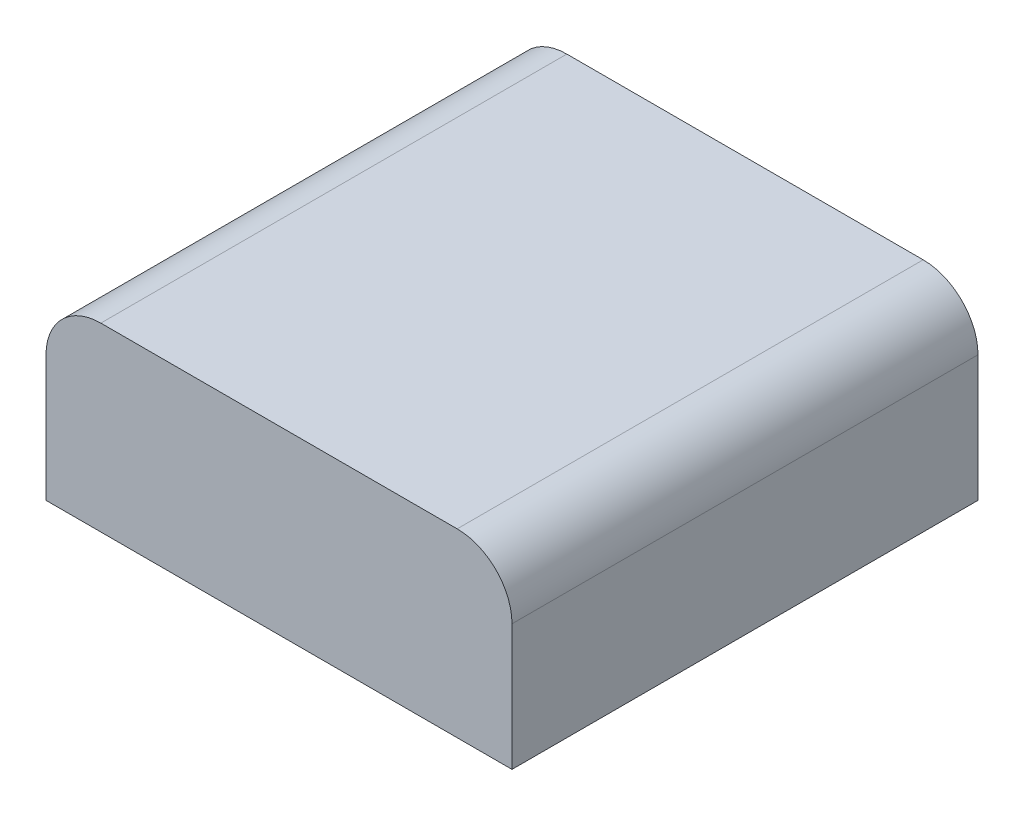
ISO-10303-21;
HEADER;
FILE_DESCRIPTION(('STEP AP214'),'2;1');
FILE_NAME('part.step','',(''),(''),'','','');
FILE_SCHEMA(('AUTOMOTIVE_DESIGN { 1 0 10303 214 1 1 1 1 }'));
ENDSEC;
DATA;
#1=APPLICATION_CONTEXT('core data for automotive mechanical design processes');
#2=APPLICATION_PROTOCOL_DEFINITION('international standard','automotive_design',2000,#1);
#3=PRODUCT_CONTEXT('',#1,'mechanical');
#4=PRODUCT('Part','Part','',(#3));
#5=PRODUCT_RELATED_PRODUCT_CATEGORY('part','',(#4));
#6=PRODUCT_DEFINITION_FORMATION('','',#4);
#7=PRODUCT_DEFINITION_CONTEXT('part definition',#1,'design');
#8=PRODUCT_DEFINITION('design','',#6,#7);
#9=PRODUCT_DEFINITION_SHAPE('','',#8);
#10=(LENGTH_UNIT() NAMED_UNIT(*) SI_UNIT(.MILLI.,.METRE.));
#11=(NAMED_UNIT(*) PLANE_ANGLE_UNIT() SI_UNIT($,.RADIAN.));
#12=(NAMED_UNIT(*) SI_UNIT($,.STERADIAN.) SOLID_ANGLE_UNIT());
#13=UNCERTAINTY_MEASURE_WITH_UNIT(LENGTH_MEASURE(1.E-05),#10,'distance_accuracy_value','');
#14=(GEOMETRIC_REPRESENTATION_CONTEXT(3) GLOBAL_UNCERTAINTY_ASSIGNED_CONTEXT((#13)) GLOBAL_UNIT_ASSIGNED_CONTEXT((#10,
#11,#12)) REPRESENTATION_CONTEXT('',''));
#15=CARTESIAN_POINT('',(0.,0.,0.));
#16=DIRECTION('',(0.,0.,1.));
#17=DIRECTION('',(1.,0.,0.));
#18=AXIS2_PLACEMENT_3D('',#15,#16,#17);
#19=CARTESIAN_POINT('',(-42.5,-16.5,42.5));
#20=DIRECTION('',(0.,1.,0.));
#21=DIRECTION('',(0.,0.,1.));
#22=AXIS2_PLACEMENT_3D('',#19,#20,#21);
#23=PLANE('',#22);
#24=DIRECTION('',(1.,0.,0.));
#25=VECTOR('',#24,1.);
#26=CARTESIAN_POINT('',(-42.5,-16.5,-42.5));
#27=LINE('',#26,#25);
#28=CARTESIAN_POINT('',(-42.5,-16.5,-42.5));
#29=VERTEX_POINT('',#28);
#30=CARTESIAN_POINT('',(42.5,-16.5,-42.5));
#31=VERTEX_POINT('',#30);
#32=EDGE_CURVE('E84',#29,#31,#27,.T.);
#33=ORIENTED_EDGE('',*,*,#32,.T.);
#34=DIRECTION('',(0.,0.,-1.));
#35=VECTOR('',#34,1.);
#36=CARTESIAN_POINT('',(42.5,-16.5,42.5));
#37=LINE('',#36,#35);
#38=CARTESIAN_POINT('',(42.5,-16.5,42.5));
#39=VERTEX_POINT('',#38);
#40=EDGE_CURVE('E126',#39,#31,#37,.T.);
#41=ORIENTED_EDGE('',*,*,#40,.F.);
#42=DIRECTION('',(1.,0.,0.));
#43=VECTOR('',#42,1.);
#44=CARTESIAN_POINT('',(-42.5,-16.5,42.5));
#45=LINE('',#44,#43);
#46=CARTESIAN_POINT('',(-42.5,-16.5,42.5));
#47=VERTEX_POINT('',#46);
#48=EDGE_CURVE('E57',#47,#39,#45,.T.);
#49=ORIENTED_EDGE('',*,*,#48,.F.);
#50=DIRECTION('',(0.,0.,-1.));
#51=VECTOR('',#50,1.);
#52=CARTESIAN_POINT('',(-42.5,-16.5,42.5));
#53=LINE('',#52,#51);
#54=EDGE_CURVE('E122',#47,#29,#53,.T.);
#55=ORIENTED_EDGE('',*,*,#54,.T.);
#56=EDGE_LOOP('',(#33,#41,#49,#55));
#57=FACE_BOUND('',#56,.T.);
#58=DIRECTION('',(1.,0.,0.));
#59=VECTOR('',#58,1.);
#60=CARTESIAN_POINT('',(-32.5,-16.5,-40.5));
#61=LINE('',#60,#59);
#62=CARTESIAN_POINT('',(-40.5,-16.5,-40.5));
#63=VERTEX_POINT('',#62);
#64=CARTESIAN_POINT('',(40.5,-16.5,-40.5));
#65=VERTEX_POINT('',#64);
#66=EDGE_CURVE('E159',#63,#65,#61,.T.);
#67=ORIENTED_EDGE('',*,*,#66,.F.);
#68=DIRECTION('',(0.,0.,-1.));
#69=VECTOR('',#68,1.);
#70=CARTESIAN_POINT('',(-40.5,-16.5,42.5));
#71=LINE('',#70,#69);
#72=CARTESIAN_POINT('',(-40.5,-16.5,40.5));
#73=VERTEX_POINT('',#72);
#74=EDGE_CURVE('E164',#73,#63,#71,.T.);
#75=ORIENTED_EDGE('',*,*,#74,.F.);
#76=DIRECTION('',(1.,0.,0.));
#77=VECTOR('',#76,1.);
#78=CARTESIAN_POINT('',(-32.5,-16.5,40.5));
#79=LINE('',#78,#77);
#80=CARTESIAN_POINT('',(40.5,-16.5,40.5));
#81=VERTEX_POINT('',#80);
#82=EDGE_CURVE('E48',#73,#81,#79,.T.);
#83=ORIENTED_EDGE('',*,*,#82,.T.);
#84=DIRECTION('',(0.,0.,-1.));
#85=VECTOR('',#84,1.);
#86=CARTESIAN_POINT('',(40.5,-16.5,42.5));
#87=LINE('',#86,#85);
#88=EDGE_CURVE('E168',#81,#65,#87,.T.);
#89=ORIENTED_EDGE('',*,*,#88,.T.);
#90=EDGE_LOOP('',(#67,#75,#83,#89));
#91=FACE_BOUND('',#90,.T.);
#92=ADVANCED_FACE('F33',(#57,#91),#23,.F.);
#93=CARTESIAN_POINT('',(42.5,6.5,42.5));
#94=DIRECTION('',(-1.,0.,0.));
#95=DIRECTION('',(0.,0.,1.));
#96=AXIS2_PLACEMENT_3D('',#93,#94,#95);
#97=PLANE('',#96);
#98=DIRECTION('',(0.,1.,0.));
#99=VECTOR('',#98,1.);
#100=CARTESIAN_POINT('',(42.5,6.5,-42.5));
#101=LINE('',#100,#99);
#102=CARTESIAN_POINT('',(42.5,6.5,-42.5));
#103=VERTEX_POINT('',#102);
#104=EDGE_CURVE('E130',#31,#103,#101,.T.);
#105=ORIENTED_EDGE('',*,*,#104,.T.);
#106=DIRECTION('',(0.,0.,-1.));
#107=VECTOR('',#106,1.);
#108=CARTESIAN_POINT('',(42.5,6.5,42.5));
#109=LINE('',#108,#107);
#110=CARTESIAN_POINT('',(42.5,6.5,42.5));
#111=VERTEX_POINT('',#110);
#112=EDGE_CURVE('E11',#111,#103,#109,.T.);
#113=ORIENTED_EDGE('',*,*,#112,.F.);
#114=DIRECTION('',(0.,1.,0.));
#115=VECTOR('',#114,1.);
#116=CARTESIAN_POINT('',(42.5,6.5,42.5));
#117=LINE('',#116,#115);
#118=EDGE_CURVE('E142',#39,#111,#117,.T.);
#119=ORIENTED_EDGE('',*,*,#118,.F.);
#120=ORIENTED_EDGE('',*,*,#40,.T.);
#121=EDGE_LOOP('',(#105,#113,#119,#120));
#122=FACE_BOUND('',#121,.T.);
#123=ADVANCED_FACE('F35',(#122),#97,.F.);
#124=CARTESIAN_POINT('',(32.5,6.5,42.5));
#125=DIRECTION('',(0.,0.,-1.));
#126=DIRECTION('',(-1.,0.,0.));
#127=AXIS2_PLACEMENT_3D('',#124,#125,#126);
#128=CYLINDRICAL_SURFACE('',#127,10.);
#129=CARTESIAN_POINT('',(32.5,6.5,-42.5));
#130=DIRECTION('',(0.,0.,1.));
#131=DIRECTION('',(1.,0.,0.));
#132=AXIS2_PLACEMENT_3D('',#129,#130,#131);
#133=CIRCLE('',#132,10.);
#134=CARTESIAN_POINT('',(32.5,16.5,-42.5));
#135=VERTEX_POINT('',#134);
#136=EDGE_CURVE('E133',#103,#135,#133,.T.);
#137=ORIENTED_EDGE('',*,*,#136,.T.);
#138=DIRECTION('',(0.,0.,-1.));
#139=VECTOR('',#138,1.);
#140=CARTESIAN_POINT('',(32.5,16.5,42.5));
#141=LINE('',#140,#139);
#142=CARTESIAN_POINT('',(32.5,16.5,42.5));
#143=VERTEX_POINT('',#142);
#144=EDGE_CURVE('E41',#143,#135,#141,.T.);
#145=ORIENTED_EDGE('',*,*,#144,.F.);
#146=CARTESIAN_POINT('',(32.5,6.5,42.5));
#147=DIRECTION('',(0.,0.,1.));
#148=DIRECTION('',(1.,0.,0.));
#149=AXIS2_PLACEMENT_3D('',#146,#147,#148);
#150=CIRCLE('',#149,10.);
#151=EDGE_CURVE('E92',#111,#143,#150,.T.);
#152=ORIENTED_EDGE('',*,*,#151,.F.);
#153=ORIENTED_EDGE('',*,*,#112,.T.);
#154=EDGE_LOOP('',(#137,#145,#152,#153));
#155=FACE_BOUND('',#154,.T.);
#156=ADVANCED_FACE('F267',(#155),#128,.T.);
#157=CARTESIAN_POINT('',(-32.5,16.5,42.5));
#158=DIRECTION('',(0.,-1.,0.));
#159=DIRECTION('',(1.,0.,0.));
#160=AXIS2_PLACEMENT_3D('',#157,#158,#159);
#161=PLANE('',#160);
#162=DIRECTION('',(-1.,0.,0.));
#163=VECTOR('',#162,1.);
#164=CARTESIAN_POINT('',(-32.5,16.5,-42.5));
#165=LINE('',#164,#163);
#166=CARTESIAN_POINT('',(-32.5,16.5,-42.5));
#167=VERTEX_POINT('',#166);
#168=EDGE_CURVE('E136',#135,#167,#165,.T.);
#169=ORIENTED_EDGE('',*,*,#168,.T.);
#170=DIRECTION('',(0.,0.,-1.));
#171=VECTOR('',#170,1.);
#172=CARTESIAN_POINT('',(-32.5,16.5,42.5));
#173=LINE('',#172,#171);
#174=CARTESIAN_POINT('',(-32.5,16.5,42.5));
#175=VERTEX_POINT('',#174);
#176=EDGE_CURVE('E121',#175,#167,#173,.T.);
#177=ORIENTED_EDGE('',*,*,#176,.F.);
#178=DIRECTION('',(-1.,0.,0.));
#179=VECTOR('',#178,1.);
#180=CARTESIAN_POINT('',(-32.5,16.5,42.5));
#181=LINE('',#180,#179);
#182=EDGE_CURVE('E109',#143,#175,#181,.T.);
#183=ORIENTED_EDGE('',*,*,#182,.F.);
#184=ORIENTED_EDGE('',*,*,#144,.T.);
#185=EDGE_LOOP('',(#169,#177,#183,#184));
#186=FACE_BOUND('',#185,.T.);
#187=ADVANCED_FACE('F148',(#186),#161,.F.);
#188=CARTESIAN_POINT('',(-32.5,6.5,42.5));
#189=DIRECTION('',(0.,0.,-1.));
#190=DIRECTION('',(-1.,0.,0.));
#191=AXIS2_PLACEMENT_3D('',#188,#189,#190);
#192=CYLINDRICAL_SURFACE('',#191,10.);
#193=CARTESIAN_POINT('',(-32.5,6.5,-42.5));
#194=DIRECTION('',(0.,0.,1.));
#195=DIRECTION('',(-1.,0.,0.));
#196=AXIS2_PLACEMENT_3D('',#193,#194,#195);
#197=CIRCLE('',#196,10.);
#198=CARTESIAN_POINT('',(-42.5,6.5,-42.5));
#199=VERTEX_POINT('',#198);
#200=EDGE_CURVE('E118',#167,#199,#197,.T.);
#201=ORIENTED_EDGE('',*,*,#200,.T.);
#202=DIRECTION('',(0.,0.,-1.));
#203=VECTOR('',#202,1.);
#204=CARTESIAN_POINT('',(-42.5,6.5,42.5));
#205=LINE('',#204,#203);
#206=CARTESIAN_POINT('',(-42.5,6.5,42.5));
#207=VERTEX_POINT('',#206);
#208=EDGE_CURVE('E115',#207,#199,#205,.T.);
#209=ORIENTED_EDGE('',*,*,#208,.F.);
#210=CARTESIAN_POINT('',(-32.5,6.5,42.5));
#211=DIRECTION('',(0.,0.,1.));
#212=DIRECTION('',(-1.,0.,0.));
#213=AXIS2_PLACEMENT_3D('',#210,#211,#212);
#214=CIRCLE('',#213,10.);
#215=EDGE_CURVE('E102',#175,#207,#214,.T.);
#216=ORIENTED_EDGE('',*,*,#215,.F.);
#217=ORIENTED_EDGE('',*,*,#176,.T.);
#218=EDGE_LOOP('',(#201,#209,#216,#217));
#219=FACE_BOUND('',#218,.T.);
#220=ADVANCED_FACE('F116',(#219),#192,.T.);
#221=CARTESIAN_POINT('',(-42.5,6.5,42.5));
#222=DIRECTION('',(1.,0.,0.));
#223=DIRECTION('',(0.,0.,-1.));
#224=AXIS2_PLACEMENT_3D('',#221,#222,#223);
#225=PLANE('',#224);
#226=DIRECTION('',(0.,-1.,0.));
#227=VECTOR('',#226,1.);
#228=CARTESIAN_POINT('',(-42.5,6.5,-42.5));
#229=LINE('',#228,#227);
#230=EDGE_CURVE('E139',#199,#29,#229,.T.);
#231=ORIENTED_EDGE('',*,*,#230,.T.);
#232=ORIENTED_EDGE('',*,*,#54,.F.);
#233=DIRECTION('',(0.,-1.,0.));
#234=VECTOR('',#233,1.);
#235=CARTESIAN_POINT('',(-42.5,6.5,42.5));
#236=LINE('',#235,#234);
#237=EDGE_CURVE('E106',#207,#47,#236,.T.);
#238=ORIENTED_EDGE('',*,*,#237,.F.);
#239=ORIENTED_EDGE('',*,*,#208,.T.);
#240=EDGE_LOOP('',(#231,#232,#238,#239));
#241=FACE_BOUND('',#240,.T.);
#242=ADVANCED_FACE('F124',(#241),#225,.F.);
#243=CARTESIAN_POINT('',(-32.5,6.5,42.5));
#244=DIRECTION('',(0.,0.,-1.));
#245=DIRECTION('',(-1.,0.,0.));
#246=AXIS2_PLACEMENT_3D('',#243,#244,#245);
#247=PLANE('',#246);
#248=ORIENTED_EDGE('',*,*,#118,.T.);
#249=ORIENTED_EDGE('',*,*,#151,.T.);
#250=ORIENTED_EDGE('',*,*,#182,.T.);
#251=ORIENTED_EDGE('',*,*,#215,.T.);
#252=ORIENTED_EDGE('',*,*,#237,.T.);
#253=ORIENTED_EDGE('',*,*,#48,.T.);
#254=EDGE_LOOP('',(#248,#249,#250,#251,#252,#253));
#255=FACE_BOUND('',#254,.T.);
#256=ADVANCED_FACE('F104',(#255),#247,.F.);
#257=CARTESIAN_POINT('',(-32.5,6.5,-42.5));
#258=DIRECTION('',(0.,0.,-1.));
#259=DIRECTION('',(-1.,0.,0.));
#260=AXIS2_PLACEMENT_3D('',#257,#258,#259);
#261=PLANE('',#260);
#262=ORIENTED_EDGE('',*,*,#104,.F.);
#263=ORIENTED_EDGE('',*,*,#32,.F.);
#264=ORIENTED_EDGE('',*,*,#230,.F.);
#265=ORIENTED_EDGE('',*,*,#200,.F.);
#266=ORIENTED_EDGE('',*,*,#168,.F.);
#267=ORIENTED_EDGE('',*,*,#136,.F.);
#268=EDGE_LOOP('',(#262,#263,#264,#265,#266,#267));
#269=FACE_BOUND('',#268,.T.);
#270=ADVANCED_FACE('F151',(#269),#261,.T.);
#271=CARTESIAN_POINT('',(40.5,6.5,42.5));
#272=DIRECTION('',(-1.,0.,0.));
#273=DIRECTION('',(0.,0.,1.));
#274=AXIS2_PLACEMENT_3D('',#271,#272,#273);
#275=PLANE('',#274);
#276=DIRECTION('',(0.,1.,0.));
#277=VECTOR('',#276,1.);
#278=CARTESIAN_POINT('',(40.5,6.5,-40.5));
#279=LINE('',#278,#277);
#280=CARTESIAN_POINT('',(40.5,6.5,-40.5));
#281=VERTEX_POINT('',#280);
#282=EDGE_CURVE('E202',#65,#281,#279,.T.);
#283=ORIENTED_EDGE('',*,*,#282,.F.);
#284=ORIENTED_EDGE('',*,*,#88,.F.);
#285=DIRECTION('',(0.,1.,0.));
#286=VECTOR('',#285,1.);
#287=CARTESIAN_POINT('',(40.5,6.5,40.5));
#288=LINE('',#287,#286);
#289=CARTESIAN_POINT('',(40.5,6.5,40.5));
#290=VERTEX_POINT('',#289);
#291=EDGE_CURVE('E162',#81,#290,#288,.T.);
#292=ORIENTED_EDGE('',*,*,#291,.T.);
#293=DIRECTION('',(0.,0.,-1.));
#294=VECTOR('',#293,1.);
#295=CARTESIAN_POINT('',(40.5,6.5,42.5));
#296=LINE('',#295,#294);
#297=EDGE_CURVE('E134',#290,#281,#296,.T.);
#298=ORIENTED_EDGE('',*,*,#297,.T.);
#299=EDGE_LOOP('',(#283,#284,#292,#298));
#300=FACE_BOUND('',#299,.T.);
#301=ADVANCED_FACE('F218',(#300),#275,.T.);
#302=CARTESIAN_POINT('',(32.5,6.5,42.5));
#303=DIRECTION('',(0.,0.,-1.));
#304=DIRECTION('',(-1.,0.,0.));
#305=AXIS2_PLACEMENT_3D('',#302,#303,#304);
#306=CYLINDRICAL_SURFACE('',#305,8.);
#307=CARTESIAN_POINT('',(32.5,6.5,-40.5));
#308=DIRECTION('',(0.,0.,-1.));
#309=DIRECTION('',(-1.,0.,0.));
#310=AXIS2_PLACEMENT_3D('',#307,#308,#309);
#311=CIRCLE('',#310,8.);
#312=CARTESIAN_POINT('',(32.5,14.5,-40.5));
#313=VERTEX_POINT('',#312);
#314=EDGE_CURVE('E195',#281,#313,#311,.F.);
#315=ORIENTED_EDGE('',*,*,#314,.F.);
#316=ORIENTED_EDGE('',*,*,#297,.F.);
#317=CARTESIAN_POINT('',(32.5,6.5,40.5));
#318=DIRECTION('',(0.,0.,-1.));
#319=DIRECTION('',(-1.,0.,0.));
#320=AXIS2_PLACEMENT_3D('',#317,#318,#319);
#321=CIRCLE('',#320,8.);
#322=CARTESIAN_POINT('',(32.5,14.5,40.5));
#323=VERTEX_POINT('',#322);
#324=EDGE_CURVE('E189',#290,#323,#321,.F.);
#325=ORIENTED_EDGE('',*,*,#324,.T.);
#326=DIRECTION('',(0.,0.,1.));
#327=VECTOR('',#326,1.);
#328=CARTESIAN_POINT('',(32.5,14.5,42.5));
#329=LINE('',#328,#327);
#330=EDGE_CURVE('E192',#323,#313,#329,.F.);
#331=ORIENTED_EDGE('',*,*,#330,.T.);
#332=EDGE_LOOP('',(#315,#316,#325,#331));
#333=FACE_BOUND('',#332,.T.);
#334=ADVANCED_FACE('F244',(#333),#306,.F.);
#335=CARTESIAN_POINT('',(-32.5,14.5,42.5));
#336=DIRECTION('',(0.,-1.,0.));
#337=DIRECTION('',(1.,0.,0.));
#338=AXIS2_PLACEMENT_3D('',#335,#336,#337);
#339=PLANE('',#338);
#340=DIRECTION('',(-1.,0.,0.));
#341=VECTOR('',#340,1.);
#342=CARTESIAN_POINT('',(-32.5,14.5,-40.5));
#343=LINE('',#342,#341);
#344=CARTESIAN_POINT('',(-32.5,14.5,-40.5));
#345=VERTEX_POINT('',#344);
#346=EDGE_CURVE('E186',#313,#345,#343,.T.);
#347=ORIENTED_EDGE('',*,*,#346,.F.);
#348=ORIENTED_EDGE('',*,*,#330,.F.);
#349=DIRECTION('',(-1.,0.,0.));
#350=VECTOR('',#349,1.);
#351=CARTESIAN_POINT('',(-32.5,14.5,40.5));
#352=LINE('',#351,#350);
#353=CARTESIAN_POINT('',(-32.5,14.5,40.5));
#354=VERTEX_POINT('',#353);
#355=EDGE_CURVE('E180',#323,#354,#352,.T.);
#356=ORIENTED_EDGE('',*,*,#355,.T.);
#357=DIRECTION('',(0.,0.,-1.));
#358=VECTOR('',#357,1.);
#359=CARTESIAN_POINT('',(-32.5,14.5,42.5));
#360=LINE('',#359,#358);
#361=EDGE_CURVE('E183',#354,#345,#360,.T.);
#362=ORIENTED_EDGE('',*,*,#361,.T.);
#363=EDGE_LOOP('',(#347,#348,#356,#362));
#364=FACE_BOUND('',#363,.T.);
#365=ADVANCED_FACE('F247',(#364),#339,.T.);
#366=CARTESIAN_POINT('',(-32.5,6.5,42.5));
#367=DIRECTION('',(0.,0.,-1.));
#368=DIRECTION('',(-1.,0.,0.));
#369=AXIS2_PLACEMENT_3D('',#366,#367,#368);
#370=CYLINDRICAL_SURFACE('',#369,8.);
#371=CARTESIAN_POINT('',(-32.5,6.5,-40.5));
#372=DIRECTION('',(0.,0.,-1.));
#373=DIRECTION('',(-1.,0.,0.));
#374=AXIS2_PLACEMENT_3D('',#371,#372,#373);
#375=CIRCLE('',#374,8.);
#376=CARTESIAN_POINT('',(-40.5,6.5,-40.5));
#377=VERTEX_POINT('',#376);
#378=EDGE_CURVE('E177',#345,#377,#375,.F.);
#379=ORIENTED_EDGE('',*,*,#378,.F.);
#380=ORIENTED_EDGE('',*,*,#361,.F.);
#381=CARTESIAN_POINT('',(-32.5,6.5,40.5));
#382=DIRECTION('',(0.,0.,-1.));
#383=DIRECTION('',(-1.,0.,0.));
#384=AXIS2_PLACEMENT_3D('',#381,#382,#383);
#385=CIRCLE('',#384,8.);
#386=CARTESIAN_POINT('',(-40.5,6.5,40.5));
#387=VERTEX_POINT('',#386);
#388=EDGE_CURVE('E174',#354,#387,#385,.F.);
#389=ORIENTED_EDGE('',*,*,#388,.T.);
#390=DIRECTION('',(0.,0.,-1.));
#391=VECTOR('',#390,1.);
#392=CARTESIAN_POINT('',(-40.5,6.5,42.5));
#393=LINE('',#392,#391);
#394=EDGE_CURVE('E167',#387,#377,#393,.T.);
#395=ORIENTED_EDGE('',*,*,#394,.T.);
#396=EDGE_LOOP('',(#379,#380,#389,#395));
#397=FACE_BOUND('',#396,.T.);
#398=ADVANCED_FACE('F250',(#397),#370,.F.);
#399=CARTESIAN_POINT('',(-40.5,6.5,42.5));
#400=DIRECTION('',(1.,0.,0.));
#401=DIRECTION('',(0.,0.,-1.));
#402=AXIS2_PLACEMENT_3D('',#399,#400,#401);
#403=PLANE('',#402);
#404=DIRECTION('',(0.,-1.,0.));
#405=VECTOR('',#404,1.);
#406=CARTESIAN_POINT('',(-40.5,6.5,-40.5));
#407=LINE('',#406,#405);
#408=EDGE_CURVE('E163',#377,#63,#407,.T.);
#409=ORIENTED_EDGE('',*,*,#408,.F.);
#410=ORIENTED_EDGE('',*,*,#394,.F.);
#411=DIRECTION('',(0.,-1.,0.));
#412=VECTOR('',#411,1.);
#413=CARTESIAN_POINT('',(-40.5,6.5,40.5));
#414=LINE('',#413,#412);
#415=EDGE_CURVE('E170',#387,#73,#414,.T.);
#416=ORIENTED_EDGE('',*,*,#415,.T.);
#417=ORIENTED_EDGE('',*,*,#74,.T.);
#418=EDGE_LOOP('',(#409,#410,#416,#417));
#419=FACE_BOUND('',#418,.T.);
#420=ADVANCED_FACE('F253',(#419),#403,.T.);
#421=CARTESIAN_POINT('',(-32.5,6.5,40.5));
#422=DIRECTION('',(0.,0.,-1.));
#423=DIRECTION('',(-1.,0.,0.));
#424=AXIS2_PLACEMENT_3D('',#421,#422,#423);
#425=PLANE('',#424);
#426=ORIENTED_EDGE('',*,*,#291,.F.);
#427=ORIENTED_EDGE('',*,*,#82,.F.);
#428=ORIENTED_EDGE('',*,*,#415,.F.);
#429=ORIENTED_EDGE('',*,*,#388,.F.);
#430=ORIENTED_EDGE('',*,*,#355,.F.);
#431=ORIENTED_EDGE('',*,*,#324,.F.);
#432=EDGE_LOOP('',(#426,#427,#428,#429,#430,#431));
#433=FACE_BOUND('',#432,.T.);
#434=ADVANCED_FACE('F240',(#433),#425,.T.);
#435=CARTESIAN_POINT('',(-32.5,6.5,-40.5));
#436=DIRECTION('',(0.,0.,-1.));
#437=DIRECTION('',(-1.,0.,0.));
#438=AXIS2_PLACEMENT_3D('',#435,#436,#437);
#439=PLANE('',#438);
#440=ORIENTED_EDGE('',*,*,#282,.T.);
#441=ORIENTED_EDGE('',*,*,#314,.T.);
#442=ORIENTED_EDGE('',*,*,#346,.T.);
#443=ORIENTED_EDGE('',*,*,#378,.T.);
#444=ORIENTED_EDGE('',*,*,#408,.T.);
#445=ORIENTED_EDGE('',*,*,#66,.T.);
#446=EDGE_LOOP('',(#440,#441,#442,#443,#444,#445));
#447=FACE_BOUND('',#446,.T.);
#448=ADVANCED_FACE('F211',(#447),#439,.F.);
#449=CLOSED_SHELL('',(#92,#123,#156,#187,#220,#242,#256,#270,#301,#334,#365,#398,#420,#434,#448));
#450=MANIFOLD_SOLID_BREP('B2',#449);
#451=ADVANCED_BREP_SHAPE_REPRESENTATION('',(#18,#450),#14);
#452=SHAPE_DEFINITION_REPRESENTATION(#9,#451);
ENDSEC;
END-ISO-10303-21;
